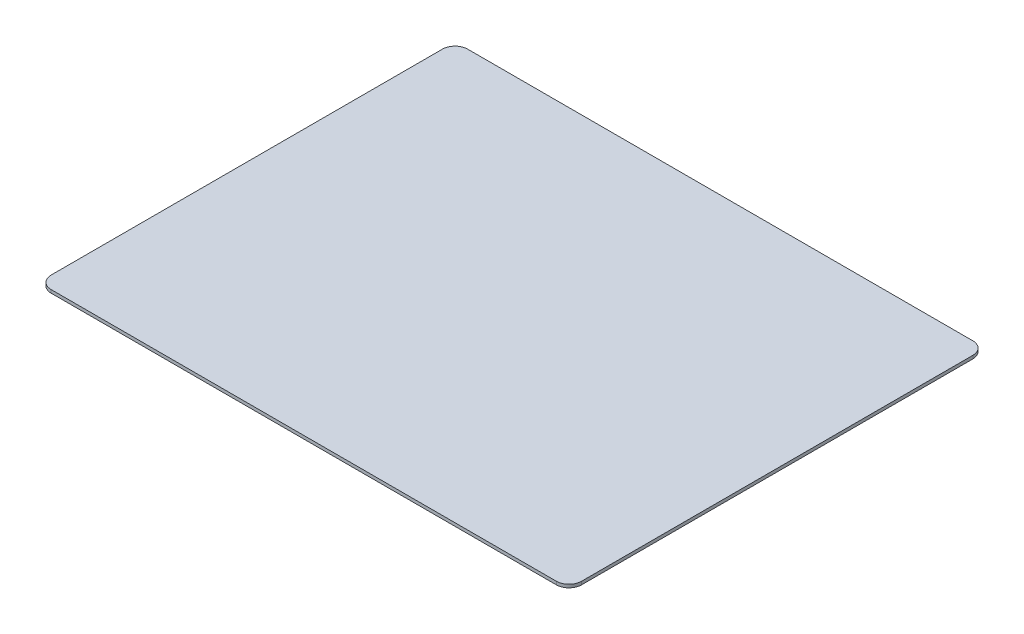
ISO-10303-21;
HEADER;
FILE_DESCRIPTION(('STEP AP214'),'2;1');
FILE_NAME('part.step','',(''),(''),'','','');
FILE_SCHEMA(('AUTOMOTIVE_DESIGN { 1 0 10303 214 1 1 1 1 }'));
ENDSEC;
DATA;
#1=APPLICATION_CONTEXT('core data for automotive mechanical design processes');
#2=APPLICATION_PROTOCOL_DEFINITION('international standard','automotive_design',2000,#1);
#3=PRODUCT_CONTEXT('',#1,'mechanical');
#4=PRODUCT('Part','Part','',(#3));
#5=PRODUCT_RELATED_PRODUCT_CATEGORY('part','',(#4));
#6=PRODUCT_DEFINITION_FORMATION('','',#4);
#7=PRODUCT_DEFINITION_CONTEXT('part definition',#1,'design');
#8=PRODUCT_DEFINITION('design','',#6,#7);
#9=PRODUCT_DEFINITION_SHAPE('','',#8);
#10=(LENGTH_UNIT() NAMED_UNIT(*) SI_UNIT(.MILLI.,.METRE.));
#11=(NAMED_UNIT(*) PLANE_ANGLE_UNIT() SI_UNIT($,.RADIAN.));
#12=(NAMED_UNIT(*) SI_UNIT($,.STERADIAN.) SOLID_ANGLE_UNIT());
#13=UNCERTAINTY_MEASURE_WITH_UNIT(LENGTH_MEASURE(1.E-05),#10,'distance_accuracy_value','');
#14=(GEOMETRIC_REPRESENTATION_CONTEXT(3) GLOBAL_UNCERTAINTY_ASSIGNED_CONTEXT((#13)) GLOBAL_UNIT_ASSIGNED_CONTEXT((#10,
#11,#12)) REPRESENTATION_CONTEXT('',''));
#15=CARTESIAN_POINT('',(0.,0.,0.));
#16=DIRECTION('',(0.,0.,1.));
#17=DIRECTION('',(1.,0.,0.));
#18=AXIS2_PLACEMENT_3D('',#15,#16,#17);
#19=CARTESIAN_POINT('',(0.,1.5875,0.));
#20=DIRECTION('',(1.,0.,0.));
#21=DIRECTION('',(0.,0.,-1.));
#22=AXIS2_PLACEMENT_3D('',#19,#20,#21);
#23=PLANE('',#22);
#24=DIRECTION('',(0.,0.,1.));
#25=VECTOR('',#24,1.);
#26=CARTESIAN_POINT('',(0.,0.,0.));
#27=LINE('',#26,#25);
#28=CARTESIAN_POINT('',(0.,0.,-203.073));
#29=VERTEX_POINT('',#28);
#30=CARTESIAN_POINT('',(0.,0.,-6.35));
#31=VERTEX_POINT('',#30);
#32=EDGE_CURVE('E126',#29,#31,#27,.T.);
#33=ORIENTED_EDGE('',*,*,#32,.T.);
#34=DIRECTION('',(0.,-1.,0.));
#35=VECTOR('',#34,1.);
#36=CARTESIAN_POINT('',(0.,1.5875,-6.35));
#37=LINE('',#36,#35);
#38=CARTESIAN_POINT('',(0.,1.5875,-6.35));
#39=VERTEX_POINT('',#38);
#40=EDGE_CURVE('E104',#31,#39,#37,.F.);
#41=ORIENTED_EDGE('',*,*,#40,.T.);
#42=DIRECTION('',(0.,0.,1.));
#43=VECTOR('',#42,1.);
#44=CARTESIAN_POINT('',(0.,1.5875,0.));
#45=LINE('',#44,#43);
#46=CARTESIAN_POINT('',(0.,1.5875,-203.073));
#47=VERTEX_POINT('',#46);
#48=EDGE_CURVE('E135',#47,#39,#45,.T.);
#49=ORIENTED_EDGE('',*,*,#48,.F.);
#50=DIRECTION('',(0.,-1.,0.));
#51=VECTOR('',#50,1.);
#52=CARTESIAN_POINT('',(0.,1.5875,-203.073));
#53=LINE('',#52,#51);
#54=EDGE_CURVE('E109',#47,#29,#53,.T.);
#55=ORIENTED_EDGE('',*,*,#54,.T.);
#56=EDGE_LOOP('',(#33,#41,#49,#55));
#57=FACE_BOUND('',#56,.T.);
#58=ADVANCED_FACE('F33',(#57),#23,.F.);
#59=CARTESIAN_POINT('',(0.,1.5875,0.));
#60=DIRECTION('',(0.,0.,-1.));
#61=DIRECTION('',(-1.,0.,0.));
#62=AXIS2_PLACEMENT_3D('',#59,#60,#61);
#63=PLANE('',#62);
#64=DIRECTION('',(1.,0.,0.));
#65=VECTOR('',#64,1.);
#66=CARTESIAN_POINT('',(0.,1.5875,0.));
#67=LINE('',#66,#65);
#68=CARTESIAN_POINT('',(6.35,1.5875,0.));
#69=VERTEX_POINT('',#68);
#70=CARTESIAN_POINT('',(260.35,1.5875,0.));
#71=VERTEX_POINT('',#70);
#72=EDGE_CURVE('E119',#69,#71,#67,.T.);
#73=ORIENTED_EDGE('',*,*,#72,.F.);
#74=DIRECTION('',(0.,-1.,0.));
#75=VECTOR('',#74,1.);
#76=CARTESIAN_POINT('',(6.35,1.5875,0.));
#77=LINE('',#76,#75);
#78=CARTESIAN_POINT('',(6.35,0.,0.));
#79=VERTEX_POINT('',#78);
#80=EDGE_CURVE('E103',#69,#79,#77,.T.);
#81=ORIENTED_EDGE('',*,*,#80,.T.);
#82=DIRECTION('',(1.,0.,0.));
#83=VECTOR('',#82,1.);
#84=CARTESIAN_POINT('',(0.,0.,0.));
#85=LINE('',#84,#83);
#86=CARTESIAN_POINT('',(260.35,0.,0.));
#87=VERTEX_POINT('',#86);
#88=EDGE_CURVE('E116',#79,#87,#85,.T.);
#89=ORIENTED_EDGE('',*,*,#88,.T.);
#90=DIRECTION('',(0.,-1.,0.));
#91=VECTOR('',#90,1.);
#92=CARTESIAN_POINT('',(260.35,1.5875,0.));
#93=LINE('',#92,#91);
#94=EDGE_CURVE('E121',#87,#71,#93,.F.);
#95=ORIENTED_EDGE('',*,*,#94,.T.);
#96=EDGE_LOOP('',(#73,#81,#89,#95));
#97=FACE_BOUND('',#96,.T.);
#98=ADVANCED_FACE('F115',(#97),#63,.F.);
#99=CARTESIAN_POINT('',(266.7,1.5875,0.));
#100=DIRECTION('',(-1.,0.,0.));
#101=DIRECTION('',(0.,0.,1.));
#102=AXIS2_PLACEMENT_3D('',#99,#100,#101);
#103=PLANE('',#102);
#104=DIRECTION('',(0.,0.,-1.));
#105=VECTOR('',#104,1.);
#106=CARTESIAN_POINT('',(266.7,0.,0.));
#107=LINE('',#106,#105);
#108=CARTESIAN_POINT('',(266.7,0.,-6.35));
#109=VERTEX_POINT('',#108);
#110=CARTESIAN_POINT('',(266.7,0.,-203.073));
#111=VERTEX_POINT('',#110);
#112=EDGE_CURVE('E125',#109,#111,#107,.T.);
#113=ORIENTED_EDGE('',*,*,#112,.T.);
#114=DIRECTION('',(0.,-1.,0.));
#115=VECTOR('',#114,1.);
#116=CARTESIAN_POINT('',(266.7,1.5875,-203.073));
#117=LINE('',#116,#115);
#118=CARTESIAN_POINT('',(266.7,1.5875,-203.073));
#119=VERTEX_POINT('',#118);
#120=EDGE_CURVE('E11',#111,#119,#117,.F.);
#121=ORIENTED_EDGE('',*,*,#120,.T.);
#122=DIRECTION('',(0.,0.,-1.));
#123=VECTOR('',#122,1.);
#124=CARTESIAN_POINT('',(266.7,1.5875,0.));
#125=LINE('',#124,#123);
#126=CARTESIAN_POINT('',(266.7,1.5875,-6.35));
#127=VERTEX_POINT('',#126);
#128=EDGE_CURVE('E161',#127,#119,#125,.T.);
#129=ORIENTED_EDGE('',*,*,#128,.F.);
#130=DIRECTION('',(0.,-1.,0.));
#131=VECTOR('',#130,1.);
#132=CARTESIAN_POINT('',(266.7,1.5875,-6.35));
#133=LINE('',#132,#131);
#134=EDGE_CURVE('E41',#127,#109,#133,.T.);
#135=ORIENTED_EDGE('',*,*,#134,.T.);
#136=EDGE_LOOP('',(#113,#121,#129,#135));
#137=FACE_BOUND('',#136,.T.);
#138=ADVANCED_FACE('F159',(#137),#103,.F.);
#139=CARTESIAN_POINT('',(0.,1.5875,-209.423));
#140=DIRECTION('',(0.,0.,1.));
#141=DIRECTION('',(1.,0.,0.));
#142=AXIS2_PLACEMENT_3D('',#139,#140,#141);
#143=PLANE('',#142);
#144=DIRECTION('',(-1.,0.,0.));
#145=VECTOR('',#144,1.);
#146=CARTESIAN_POINT('',(0.,0.,-209.423));
#147=LINE('',#146,#145);
#148=CARTESIAN_POINT('',(260.35,0.,-209.423));
#149=VERTEX_POINT('',#148);
#150=CARTESIAN_POINT('',(6.35,0.,-209.423));
#151=VERTEX_POINT('',#150);
#152=EDGE_CURVE('E129',#149,#151,#147,.T.);
#153=ORIENTED_EDGE('',*,*,#152,.T.);
#154=DIRECTION('',(0.,-1.,0.));
#155=VECTOR('',#154,1.);
#156=CARTESIAN_POINT('',(6.35,1.5875,-209.423));
#157=LINE('',#156,#155);
#158=CARTESIAN_POINT('',(6.35,1.5875,-209.423));
#159=VERTEX_POINT('',#158);
#160=EDGE_CURVE('E48',#151,#159,#157,.F.);
#161=ORIENTED_EDGE('',*,*,#160,.T.);
#162=DIRECTION('',(-1.,0.,0.));
#163=VECTOR('',#162,1.);
#164=CARTESIAN_POINT('',(0.,1.5875,-209.423));
#165=LINE('',#164,#163);
#166=CARTESIAN_POINT('',(260.35,1.5875,-209.423));
#167=VERTEX_POINT('',#166);
#168=EDGE_CURVE('E136',#167,#159,#165,.T.);
#169=ORIENTED_EDGE('',*,*,#168,.F.);
#170=DIRECTION('',(0.,-1.,0.));
#171=VECTOR('',#170,1.);
#172=CARTESIAN_POINT('',(260.35,1.5875,-209.423));
#173=LINE('',#172,#171);
#174=EDGE_CURVE('E152',#167,#149,#173,.T.);
#175=ORIENTED_EDGE('',*,*,#174,.T.);
#176=EDGE_LOOP('',(#153,#161,#169,#175));
#177=FACE_BOUND('',#176,.T.);
#178=ADVANCED_FACE('F168',(#177),#143,.F.);
#179=CARTESIAN_POINT('',(0.,1.5875,0.));
#180=DIRECTION('',(0.,-1.,0.));
#181=DIRECTION('',(0.,0.,-1.));
#182=AXIS2_PLACEMENT_3D('',#179,#180,#181);
#183=PLANE('',#182);
#184=ORIENTED_EDGE('',*,*,#48,.T.);
#185=CARTESIAN_POINT('',(6.35,1.5875,-6.35));
#186=DIRECTION('',(0.,-1.,0.));
#187=DIRECTION('',(0.,0.,-1.));
#188=AXIS2_PLACEMENT_3D('',#185,#186,#187);
#189=CIRCLE('',#188,6.35);
#190=EDGE_CURVE('E150',#39,#69,#189,.F.);
#191=ORIENTED_EDGE('',*,*,#190,.T.);
#192=ORIENTED_EDGE('',*,*,#72,.T.);
#193=CARTESIAN_POINT('',(260.35,1.5875,-6.35));
#194=DIRECTION('',(0.,-1.,0.));
#195=DIRECTION('',(0.,0.,-1.));
#196=AXIS2_PLACEMENT_3D('',#193,#194,#195);
#197=CIRCLE('',#196,6.35);
#198=EDGE_CURVE('E145',#71,#127,#197,.F.);
#199=ORIENTED_EDGE('',*,*,#198,.T.);
#200=ORIENTED_EDGE('',*,*,#128,.T.);
#201=CARTESIAN_POINT('',(260.35,1.5875,-203.073));
#202=DIRECTION('',(0.,-1.,0.));
#203=DIRECTION('',(0.,0.,-1.));
#204=AXIS2_PLACEMENT_3D('',#201,#202,#203);
#205=CIRCLE('',#204,6.35);
#206=EDGE_CURVE('E55',#119,#167,#205,.F.);
#207=ORIENTED_EDGE('',*,*,#206,.T.);
#208=ORIENTED_EDGE('',*,*,#168,.T.);
#209=CARTESIAN_POINT('',(6.35,1.5875,-203.073));
#210=DIRECTION('',(0.,-1.,0.));
#211=DIRECTION('',(0.,0.,-1.));
#212=AXIS2_PLACEMENT_3D('',#209,#210,#211);
#213=CIRCLE('',#212,6.35);
#214=EDGE_CURVE('E148',#159,#47,#213,.F.);
#215=ORIENTED_EDGE('',*,*,#214,.T.);
#216=EDGE_LOOP('',(#184,#191,#192,#199,#200,#207,#208,#215));
#217=FACE_BOUND('',#216,.T.);
#218=ADVANCED_FACE('F175',(#217),#183,.F.);
#219=CARTESIAN_POINT('',(0.,0.,0.));
#220=DIRECTION('',(0.,-1.,0.));
#221=DIRECTION('',(0.,0.,-1.));
#222=AXIS2_PLACEMENT_3D('',#219,#220,#221);
#223=PLANE('',#222);
#224=ORIENTED_EDGE('',*,*,#88,.F.);
#225=CARTESIAN_POINT('',(6.35,0.,-6.35));
#226=DIRECTION('',(0.,-1.,0.));
#227=DIRECTION('',(0.,0.,-1.));
#228=AXIS2_PLACEMENT_3D('',#225,#226,#227);
#229=CIRCLE('',#228,6.35);
#230=EDGE_CURVE('E99',#79,#31,#229,.T.);
#231=ORIENTED_EDGE('',*,*,#230,.T.);
#232=ORIENTED_EDGE('',*,*,#32,.F.);
#233=CARTESIAN_POINT('',(6.35,0.,-203.073));
#234=DIRECTION('',(0.,-1.,0.));
#235=DIRECTION('',(0.,0.,-1.));
#236=AXIS2_PLACEMENT_3D('',#233,#234,#235);
#237=CIRCLE('',#236,6.35);
#238=EDGE_CURVE('E110',#29,#151,#237,.T.);
#239=ORIENTED_EDGE('',*,*,#238,.T.);
#240=ORIENTED_EDGE('',*,*,#152,.F.);
#241=CARTESIAN_POINT('',(260.35,0.,-203.073));
#242=DIRECTION('',(0.,-1.,0.));
#243=DIRECTION('',(0.,0.,-1.));
#244=AXIS2_PLACEMENT_3D('',#241,#242,#243);
#245=CIRCLE('',#244,6.35);
#246=EDGE_CURVE('E139',#149,#111,#245,.T.);
#247=ORIENTED_EDGE('',*,*,#246,.T.);
#248=ORIENTED_EDGE('',*,*,#112,.F.);
#249=CARTESIAN_POINT('',(260.35,0.,-6.35));
#250=DIRECTION('',(0.,-1.,0.));
#251=DIRECTION('',(0.,0.,-1.));
#252=AXIS2_PLACEMENT_3D('',#249,#250,#251);
#253=CIRCLE('',#252,6.35);
#254=EDGE_CURVE('E120',#109,#87,#253,.T.);
#255=ORIENTED_EDGE('',*,*,#254,.T.);
#256=EDGE_LOOP('',(#224,#231,#232,#239,#240,#247,#248,#255));
#257=FACE_BOUND('',#256,.T.);
#258=ADVANCED_FACE('F123',(#257),#223,.T.);
#259=CARTESIAN_POINT('',(6.35,1.5875,-6.35));
#260=DIRECTION('',(0.,-1.,0.));
#261=DIRECTION('',(0.,0.,-1.));
#262=AXIS2_PLACEMENT_3D('',#259,#260,#261);
#263=CYLINDRICAL_SURFACE('',#262,6.35);
#264=ORIENTED_EDGE('',*,*,#190,.F.);
#265=ORIENTED_EDGE('',*,*,#40,.F.);
#266=ORIENTED_EDGE('',*,*,#230,.F.);
#267=ORIENTED_EDGE('',*,*,#80,.F.);
#268=EDGE_LOOP('',(#264,#265,#266,#267));
#269=FACE_BOUND('',#268,.T.);
#270=ADVANCED_FACE('F102',(#269),#263,.T.);
#271=CARTESIAN_POINT('',(6.35,1.5875,-203.073));
#272=DIRECTION('',(0.,-1.,0.));
#273=DIRECTION('',(0.,0.,-1.));
#274=AXIS2_PLACEMENT_3D('',#271,#272,#273);
#275=CYLINDRICAL_SURFACE('',#274,6.35);
#276=ORIENTED_EDGE('',*,*,#214,.F.);
#277=ORIENTED_EDGE('',*,*,#160,.F.);
#278=ORIENTED_EDGE('',*,*,#238,.F.);
#279=ORIENTED_EDGE('',*,*,#54,.F.);
#280=EDGE_LOOP('',(#276,#277,#278,#279));
#281=FACE_BOUND('',#280,.T.);
#282=ADVANCED_FACE('F179',(#281),#275,.T.);
#283=CARTESIAN_POINT('',(260.35,1.5875,-203.073));
#284=DIRECTION('',(0.,-1.,0.));
#285=DIRECTION('',(0.,0.,-1.));
#286=AXIS2_PLACEMENT_3D('',#283,#284,#285);
#287=CYLINDRICAL_SURFACE('',#286,6.35);
#288=ORIENTED_EDGE('',*,*,#206,.F.);
#289=ORIENTED_EDGE('',*,*,#120,.F.);
#290=ORIENTED_EDGE('',*,*,#246,.F.);
#291=ORIENTED_EDGE('',*,*,#174,.F.);
#292=EDGE_LOOP('',(#288,#289,#290,#291));
#293=FACE_BOUND('',#292,.T.);
#294=ADVANCED_FACE('F167',(#293),#287,.T.);
#295=CARTESIAN_POINT('',(260.35,1.5875,-6.35));
#296=DIRECTION('',(0.,-1.,0.));
#297=DIRECTION('',(0.,0.,-1.));
#298=AXIS2_PLACEMENT_3D('',#295,#296,#297);
#299=CYLINDRICAL_SURFACE('',#298,6.35);
#300=ORIENTED_EDGE('',*,*,#198,.F.);
#301=ORIENTED_EDGE('',*,*,#94,.F.);
#302=ORIENTED_EDGE('',*,*,#254,.F.);
#303=ORIENTED_EDGE('',*,*,#134,.F.);
#304=EDGE_LOOP('',(#300,#301,#302,#303));
#305=FACE_BOUND('',#304,.T.);
#306=ADVANCED_FACE('F35',(#305),#299,.T.);
#307=CLOSED_SHELL('',(#58,#98,#138,#178,#218,#258,#270,#282,#294,#306));
#308=MANIFOLD_SOLID_BREP('B2',#307);
#309=ADVANCED_BREP_SHAPE_REPRESENTATION('',(#18,#308),#14);
#310=SHAPE_DEFINITION_REPRESENTATION(#9,#309);
ENDSEC;
END-ISO-10303-21;
